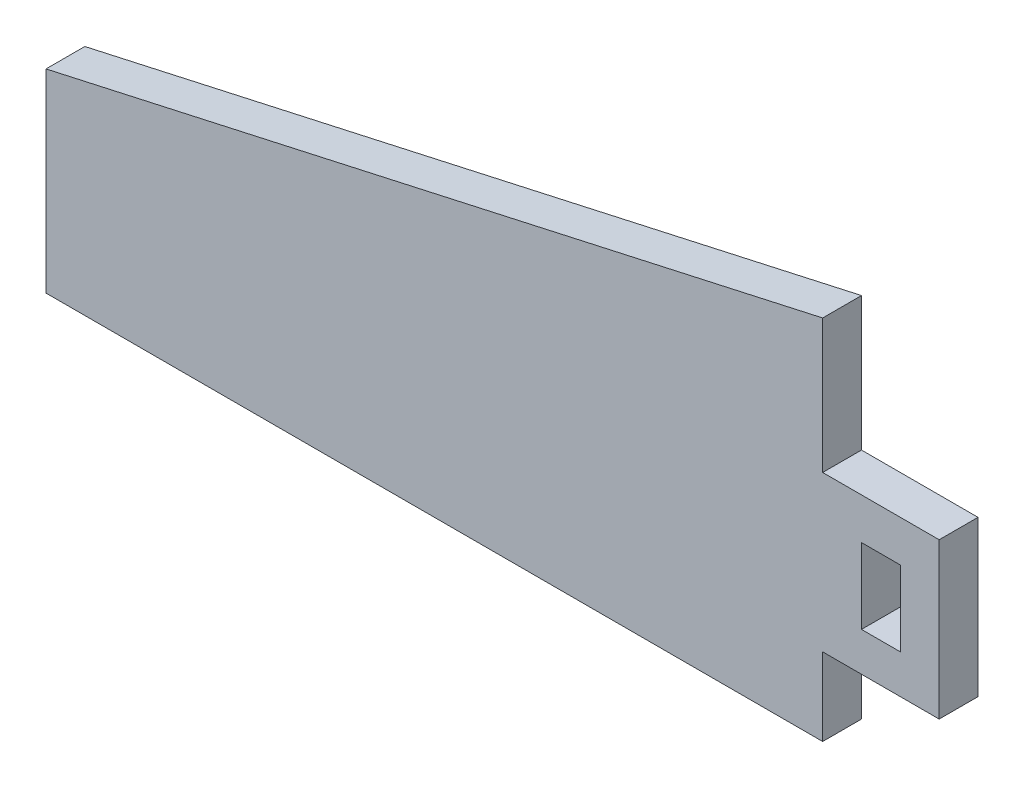
ISO-10303-21;
HEADER;
FILE_DESCRIPTION(('STEP AP214'),'2;1');
FILE_NAME('part.step','',(''),(''),'','','');
FILE_SCHEMA(('AUTOMOTIVE_DESIGN { 1 0 10303 214 1 1 1 1 }'));
ENDSEC;
DATA;
#1=APPLICATION_CONTEXT('core data for automotive mechanical design processes');
#2=APPLICATION_PROTOCOL_DEFINITION('international standard','automotive_design',2000,#1);
#3=PRODUCT_CONTEXT('',#1,'mechanical');
#4=PRODUCT('Part','Part','',(#3));
#5=PRODUCT_RELATED_PRODUCT_CATEGORY('part','',(#4));
#6=PRODUCT_DEFINITION_FORMATION('','',#4);
#7=PRODUCT_DEFINITION_CONTEXT('part definition',#1,'design');
#8=PRODUCT_DEFINITION('design','',#6,#7);
#9=PRODUCT_DEFINITION_SHAPE('','',#8);
#10=(LENGTH_UNIT() NAMED_UNIT(*) SI_UNIT(.MILLI.,.METRE.));
#11=(NAMED_UNIT(*) PLANE_ANGLE_UNIT() SI_UNIT($,.RADIAN.));
#12=(NAMED_UNIT(*) SI_UNIT($,.STERADIAN.) SOLID_ANGLE_UNIT());
#13=UNCERTAINTY_MEASURE_WITH_UNIT(LENGTH_MEASURE(1.E-05),#10,'distance_accuracy_value','');
#14=(GEOMETRIC_REPRESENTATION_CONTEXT(3) GLOBAL_UNCERTAINTY_ASSIGNED_CONTEXT((#13)) GLOBAL_UNIT_ASSIGNED_CONTEXT((#10,
#11,#12)) REPRESENTATION_CONTEXT('',''));
#15=CARTESIAN_POINT('',(0.,0.,0.));
#16=DIRECTION('',(0.,0.,1.));
#17=DIRECTION('',(1.,0.,0.));
#18=AXIS2_PLACEMENT_3D('',#15,#16,#17);
#19=CARTESIAN_POINT('',(0.,0.,5.));
#20=DIRECTION('',(0.,0.,-1.));
#21=DIRECTION('',(-1.,0.,0.));
#22=AXIS2_PLACEMENT_3D('',#19,#20,#21);
#23=PLANE('',#22);
#24=DIRECTION('',(0.,-1.,0.));
#25=VECTOR('',#24,1.);
#26=CARTESIAN_POINT('',(0.,0.,5.));
#27=LINE('',#26,#25);
#28=CARTESIAN_POINT('',(0.,25.,5.));
#29=VERTEX_POINT('',#28);
#30=CARTESIAN_POINT('',(0.,0.,5.));
#31=VERTEX_POINT('',#30);
#32=EDGE_CURVE('E160',#29,#31,#27,.T.);
#33=ORIENTED_EDGE('',*,*,#32,.T.);
#34=DIRECTION('',(1.,0.,0.));
#35=VECTOR('',#34,1.);
#36=CARTESIAN_POINT('',(0.,0.,5.));
#37=LINE('',#36,#35);
#38=CARTESIAN_POINT('',(100.,0.,5.));
#39=VERTEX_POINT('',#38);
#40=EDGE_CURVE('E163',#31,#39,#37,.T.);
#41=ORIENTED_EDGE('',*,*,#40,.T.);
#42=DIRECTION('',(0.,1.,0.));
#43=VECTOR('',#42,1.);
#44=CARTESIAN_POINT('',(100.,0.,5.));
#45=LINE('',#44,#43);
#46=CARTESIAN_POINT('',(100.,10.,5.));
#47=VERTEX_POINT('',#46);
#48=EDGE_CURVE('E166',#39,#47,#45,.T.);
#49=ORIENTED_EDGE('',*,*,#48,.T.);
#50=DIRECTION('',(1.,0.,0.));
#51=VECTOR('',#50,1.);
#52=CARTESIAN_POINT('',(100.,10.,5.));
#53=LINE('',#52,#51);
#54=CARTESIAN_POINT('',(115.,10.,5.));
#55=VERTEX_POINT('',#54);
#56=EDGE_CURVE('E168',#47,#55,#53,.T.);
#57=ORIENTED_EDGE('',*,*,#56,.T.);
#58=DIRECTION('',(0.,1.,0.));
#59=VECTOR('',#58,1.);
#60=CARTESIAN_POINT('',(115.,30.,5.));
#61=LINE('',#60,#59);
#62=CARTESIAN_POINT('',(115.,30.,5.));
#63=VERTEX_POINT('',#62);
#64=EDGE_CURVE('E170',#55,#63,#61,.T.);
#65=ORIENTED_EDGE('',*,*,#64,.T.);
#66=DIRECTION('',(-1.,0.,0.));
#67=VECTOR('',#66,1.);
#68=CARTESIAN_POINT('',(100.,30.,5.));
#69=LINE('',#68,#67);
#70=CARTESIAN_POINT('',(100.,30.,5.));
#71=VERTEX_POINT('',#70);
#72=EDGE_CURVE('E172',#63,#71,#69,.T.);
#73=ORIENTED_EDGE('',*,*,#72,.T.);
#74=DIRECTION('',(0.,1.,0.));
#75=VECTOR('',#74,1.);
#76=CARTESIAN_POINT('',(100.,30.,5.));
#77=LINE('',#76,#75);
#78=CARTESIAN_POINT('',(100.,47.2296627947885,5.));
#79=VERTEX_POINT('',#78);
#80=EDGE_CURVE('E174',#71,#79,#77,.T.);
#81=ORIENTED_EDGE('',*,*,#80,.T.);
#82=DIRECTION('',(-0.976171676674704,-0.216999672023019,0.));
#83=VECTOR('',#82,1.);
#84=CARTESIAN_POINT('',(100.,47.2296627947885,5.));
#85=LINE('',#84,#83);
#86=EDGE_CURVE('E176',#79,#29,#85,.T.);
#87=ORIENTED_EDGE('',*,*,#86,.T.);
#88=EDGE_LOOP('',(#33,#41,#49,#57,#65,#73,#81,#87));
#89=FACE_BOUND('',#88,.T.);
#90=DIRECTION('',(0.,-1.,0.));
#91=VECTOR('',#90,1.);
#92=CARTESIAN_POINT('',(105.,24.6854799336373,5.));
#93=LINE('',#92,#91);
#94=CARTESIAN_POINT('',(105.,24.6854799336373,5.));
#95=VERTEX_POINT('',#94);
#96=CARTESIAN_POINT('',(105.,15.,5.));
#97=VERTEX_POINT('',#96);
#98=EDGE_CURVE('E124',#95,#97,#93,.T.);
#99=ORIENTED_EDGE('',*,*,#98,.F.);
#100=DIRECTION('',(-1.,0.,0.));
#101=VECTOR('',#100,1.);
#102=CARTESIAN_POINT('',(105.,24.6854799336373,5.));
#103=LINE('',#102,#101);
#104=CARTESIAN_POINT('',(110.,24.6854799336373,5.));
#105=VERTEX_POINT('',#104);
#106=EDGE_CURVE('E146',#105,#95,#103,.T.);
#107=ORIENTED_EDGE('',*,*,#106,.F.);
#108=DIRECTION('',(0.,1.,0.));
#109=VECTOR('',#108,1.);
#110=CARTESIAN_POINT('',(110.,24.6854799336373,5.));
#111=LINE('',#110,#109);
#112=CARTESIAN_POINT('',(110.,15.,5.));
#113=VERTEX_POINT('',#112);
#114=EDGE_CURVE('E144',#113,#105,#111,.T.);
#115=ORIENTED_EDGE('',*,*,#114,.F.);
#116=DIRECTION('',(1.,0.,0.));
#117=VECTOR('',#116,1.);
#118=CARTESIAN_POINT('',(105.,15.,5.));
#119=LINE('',#118,#117);
#120=EDGE_CURVE('E132',#97,#113,#119,.T.);
#121=ORIENTED_EDGE('',*,*,#120,.F.);
#122=EDGE_LOOP('',(#99,#107,#115,#121));
#123=FACE_BOUND('',#122,.T.);
#124=ADVANCED_FACE('F35',(#89,#123),#23,.F.);
#125=CARTESIAN_POINT('',(0.,0.,0.));
#126=DIRECTION('',(0.,0.,-1.));
#127=DIRECTION('',(-1.,0.,0.));
#128=AXIS2_PLACEMENT_3D('',#125,#126,#127);
#129=PLANE('',#128);
#130=DIRECTION('',(0.,-1.,0.));
#131=VECTOR('',#130,1.);
#132=CARTESIAN_POINT('',(0.,0.,0.));
#133=LINE('',#132,#131);
#134=CARTESIAN_POINT('',(0.,25.,0.));
#135=VERTEX_POINT('',#134);
#136=CARTESIAN_POINT('',(0.,0.,0.));
#137=VERTEX_POINT('',#136);
#138=EDGE_CURVE('E140',#135,#137,#133,.T.);
#139=ORIENTED_EDGE('',*,*,#138,.F.);
#140=DIRECTION('',(-0.976171676674704,-0.216999672023019,0.));
#141=VECTOR('',#140,1.);
#142=CARTESIAN_POINT('',(100.,47.2296627947885,0.));
#143=LINE('',#142,#141);
#144=CARTESIAN_POINT('',(100.,47.2296627947885,0.));
#145=VERTEX_POINT('',#144);
#146=EDGE_CURVE('E164',#145,#135,#143,.T.);
#147=ORIENTED_EDGE('',*,*,#146,.F.);
#148=DIRECTION('',(0.,1.,0.));
#149=VECTOR('',#148,1.);
#150=CARTESIAN_POINT('',(100.,30.,0.));
#151=LINE('',#150,#149);
#152=CARTESIAN_POINT('',(100.,30.,0.));
#153=VERTEX_POINT('',#152);
#154=EDGE_CURVE('E191',#153,#145,#151,.T.);
#155=ORIENTED_EDGE('',*,*,#154,.F.);
#156=DIRECTION('',(-1.,0.,0.));
#157=VECTOR('',#156,1.);
#158=CARTESIAN_POINT('',(100.,30.,0.));
#159=LINE('',#158,#157);
#160=CARTESIAN_POINT('',(115.,30.,0.));
#161=VERTEX_POINT('',#160);
#162=EDGE_CURVE('E189',#161,#153,#159,.T.);
#163=ORIENTED_EDGE('',*,*,#162,.F.);
#164=DIRECTION('',(0.,1.,0.));
#165=VECTOR('',#164,1.);
#166=CARTESIAN_POINT('',(115.,30.,0.));
#167=LINE('',#166,#165);
#168=CARTESIAN_POINT('',(115.,10.,0.));
#169=VERTEX_POINT('',#168);
#170=EDGE_CURVE('E187',#169,#161,#167,.T.);
#171=ORIENTED_EDGE('',*,*,#170,.F.);
#172=DIRECTION('',(1.,0.,0.));
#173=VECTOR('',#172,1.);
#174=CARTESIAN_POINT('',(100.,10.,0.));
#175=LINE('',#174,#173);
#176=CARTESIAN_POINT('',(100.,10.,0.));
#177=VERTEX_POINT('',#176);
#178=EDGE_CURVE('E185',#177,#169,#175,.T.);
#179=ORIENTED_EDGE('',*,*,#178,.F.);
#180=DIRECTION('',(0.,1.,0.));
#181=VECTOR('',#180,1.);
#182=CARTESIAN_POINT('',(100.,0.,0.));
#183=LINE('',#182,#181);
#184=CARTESIAN_POINT('',(100.,0.,0.));
#185=VERTEX_POINT('',#184);
#186=EDGE_CURVE('E183',#185,#177,#183,.T.);
#187=ORIENTED_EDGE('',*,*,#186,.F.);
#188=DIRECTION('',(1.,0.,0.));
#189=VECTOR('',#188,1.);
#190=CARTESIAN_POINT('',(0.,0.,0.));
#191=LINE('',#190,#189);
#192=EDGE_CURVE('E181',#137,#185,#191,.T.);
#193=ORIENTED_EDGE('',*,*,#192,.F.);
#194=EDGE_LOOP('',(#139,#147,#155,#163,#171,#179,#187,#193));
#195=FACE_BOUND('',#194,.T.);
#196=DIRECTION('',(-1.,0.,0.));
#197=VECTOR('',#196,1.);
#198=CARTESIAN_POINT('',(105.,24.6854799336373,0.));
#199=LINE('',#198,#197);
#200=CARTESIAN_POINT('',(110.,24.6854799336373,0.));
#201=VERTEX_POINT('',#200);
#202=CARTESIAN_POINT('',(105.,24.6854799336373,0.));
#203=VERTEX_POINT('',#202);
#204=EDGE_CURVE('E133',#201,#203,#199,.T.);
#205=ORIENTED_EDGE('',*,*,#204,.T.);
#206=DIRECTION('',(0.,-1.,0.));
#207=VECTOR('',#206,1.);
#208=CARTESIAN_POINT('',(105.,24.6854799336373,0.));
#209=LINE('',#208,#207);
#210=CARTESIAN_POINT('',(105.,15.,0.));
#211=VERTEX_POINT('',#210);
#212=EDGE_CURVE('E58',#203,#211,#209,.T.);
#213=ORIENTED_EDGE('',*,*,#212,.T.);
#214=DIRECTION('',(1.,0.,0.));
#215=VECTOR('',#214,1.);
#216=CARTESIAN_POINT('',(105.,15.,0.));
#217=LINE('',#216,#215);
#218=CARTESIAN_POINT('',(110.,15.,0.));
#219=VERTEX_POINT('',#218);
#220=EDGE_CURVE('E139',#211,#219,#217,.T.);
#221=ORIENTED_EDGE('',*,*,#220,.T.);
#222=DIRECTION('',(0.,1.,0.));
#223=VECTOR('',#222,1.);
#224=CARTESIAN_POINT('',(110.,24.6854799336373,0.));
#225=LINE('',#224,#223);
#226=EDGE_CURVE('E152',#219,#201,#225,.T.);
#227=ORIENTED_EDGE('',*,*,#226,.T.);
#228=EDGE_LOOP('',(#205,#213,#221,#227));
#229=FACE_BOUND('',#228,.T.);
#230=ADVANCED_FACE('F221',(#195,#229),#129,.T.);
#231=CARTESIAN_POINT('',(0.,0.,5.));
#232=DIRECTION('',(1.,0.,0.));
#233=DIRECTION('',(0.,0.,-1.));
#234=AXIS2_PLACEMENT_3D('',#231,#232,#233);
#235=PLANE('',#234);
#236=ORIENTED_EDGE('',*,*,#138,.T.);
#237=DIRECTION('',(0.,0.,-1.));
#238=VECTOR('',#237,1.);
#239=CARTESIAN_POINT('',(0.,0.,5.));
#240=LINE('',#239,#238);
#241=EDGE_CURVE('E11',#31,#137,#240,.T.);
#242=ORIENTED_EDGE('',*,*,#241,.F.);
#243=ORIENTED_EDGE('',*,*,#32,.F.);
#244=DIRECTION('',(0.,0.,-1.));
#245=VECTOR('',#244,1.);
#246=CARTESIAN_POINT('',(0.,25.,5.));
#247=LINE('',#246,#245);
#248=EDGE_CURVE('E178',#29,#135,#247,.T.);
#249=ORIENTED_EDGE('',*,*,#248,.T.);
#250=EDGE_LOOP('',(#236,#242,#243,#249));
#251=FACE_BOUND('',#250,.T.);
#252=ADVANCED_FACE('F37',(#251),#235,.F.);
#253=CARTESIAN_POINT('',(0.,0.,5.));
#254=DIRECTION('',(0.,1.,0.));
#255=DIRECTION('',(0.,0.,1.));
#256=AXIS2_PLACEMENT_3D('',#253,#254,#255);
#257=PLANE('',#256);
#258=ORIENTED_EDGE('',*,*,#192,.T.);
#259=DIRECTION('',(0.,0.,-1.));
#260=VECTOR('',#259,1.);
#261=CARTESIAN_POINT('',(100.,0.,5.));
#262=LINE('',#261,#260);
#263=EDGE_CURVE('E43',#39,#185,#262,.T.);
#264=ORIENTED_EDGE('',*,*,#263,.F.);
#265=ORIENTED_EDGE('',*,*,#40,.F.);
#266=ORIENTED_EDGE('',*,*,#241,.T.);
#267=EDGE_LOOP('',(#258,#264,#265,#266));
#268=FACE_BOUND('',#267,.T.);
#269=ADVANCED_FACE('F238',(#268),#257,.F.);
#270=CARTESIAN_POINT('',(100.,0.,5.));
#271=DIRECTION('',(-1.,0.,0.));
#272=DIRECTION('',(0.,0.,1.));
#273=AXIS2_PLACEMENT_3D('',#270,#271,#272);
#274=PLANE('',#273);
#275=ORIENTED_EDGE('',*,*,#186,.T.);
#276=DIRECTION('',(0.,0.,-1.));
#277=VECTOR('',#276,1.);
#278=CARTESIAN_POINT('',(100.,10.,5.));
#279=LINE('',#278,#277);
#280=EDGE_CURVE('E208',#47,#177,#279,.T.);
#281=ORIENTED_EDGE('',*,*,#280,.F.);
#282=ORIENTED_EDGE('',*,*,#48,.F.);
#283=ORIENTED_EDGE('',*,*,#263,.T.);
#284=EDGE_LOOP('',(#275,#281,#282,#283));
#285=FACE_BOUND('',#284,.T.);
#286=ADVANCED_FACE('F215',(#285),#274,.F.);
#287=CARTESIAN_POINT('',(100.,10.,5.));
#288=DIRECTION('',(0.,1.,0.));
#289=DIRECTION('',(0.,0.,1.));
#290=AXIS2_PLACEMENT_3D('',#287,#288,#289);
#291=PLANE('',#290);
#292=ORIENTED_EDGE('',*,*,#178,.T.);
#293=DIRECTION('',(0.,0.,-1.));
#294=VECTOR('',#293,1.);
#295=CARTESIAN_POINT('',(115.,10.,5.));
#296=LINE('',#295,#294);
#297=EDGE_CURVE('E205',#55,#169,#296,.T.);
#298=ORIENTED_EDGE('',*,*,#297,.F.);
#299=ORIENTED_EDGE('',*,*,#56,.F.);
#300=ORIENTED_EDGE('',*,*,#280,.T.);
#301=EDGE_LOOP('',(#292,#298,#299,#300));
#302=FACE_BOUND('',#301,.T.);
#303=ADVANCED_FACE('F227',(#302),#291,.F.);
#304=CARTESIAN_POINT('',(115.,30.,5.));
#305=DIRECTION('',(-1.,0.,0.));
#306=DIRECTION('',(0.,0.,1.));
#307=AXIS2_PLACEMENT_3D('',#304,#305,#306);
#308=PLANE('',#307);
#309=ORIENTED_EDGE('',*,*,#170,.T.);
#310=DIRECTION('',(0.,0.,-1.));
#311=VECTOR('',#310,1.);
#312=CARTESIAN_POINT('',(115.,30.,5.));
#313=LINE('',#312,#311);
#314=EDGE_CURVE('E202',#63,#161,#313,.T.);
#315=ORIENTED_EDGE('',*,*,#314,.F.);
#316=ORIENTED_EDGE('',*,*,#64,.F.);
#317=ORIENTED_EDGE('',*,*,#297,.T.);
#318=EDGE_LOOP('',(#309,#315,#316,#317));
#319=FACE_BOUND('',#318,.T.);
#320=ADVANCED_FACE('F231',(#319),#308,.F.);
#321=CARTESIAN_POINT('',(100.,30.,5.));
#322=DIRECTION('',(0.,-1.,0.));
#323=DIRECTION('',(0.,0.,-1.));
#324=AXIS2_PLACEMENT_3D('',#321,#322,#323);
#325=PLANE('',#324);
#326=ORIENTED_EDGE('',*,*,#162,.T.);
#327=DIRECTION('',(0.,0.,-1.));
#328=VECTOR('',#327,1.);
#329=CARTESIAN_POINT('',(100.,30.,5.));
#330=LINE('',#329,#328);
#331=EDGE_CURVE('E199',#71,#153,#330,.T.);
#332=ORIENTED_EDGE('',*,*,#331,.F.);
#333=ORIENTED_EDGE('',*,*,#72,.F.);
#334=ORIENTED_EDGE('',*,*,#314,.T.);
#335=EDGE_LOOP('',(#326,#332,#333,#334));
#336=FACE_BOUND('',#335,.T.);
#337=ADVANCED_FACE('F251',(#336),#325,.F.);
#338=CARTESIAN_POINT('',(100.,30.,5.));
#339=DIRECTION('',(-1.,0.,0.));
#340=DIRECTION('',(0.,0.,1.));
#341=AXIS2_PLACEMENT_3D('',#338,#339,#340);
#342=PLANE('',#341);
#343=ORIENTED_EDGE('',*,*,#154,.T.);
#344=DIRECTION('',(0.,0.,-1.));
#345=VECTOR('',#344,1.);
#346=CARTESIAN_POINT('',(100.,47.2296627947885,5.));
#347=LINE('',#346,#345);
#348=EDGE_CURVE('E196',#79,#145,#347,.T.);
#349=ORIENTED_EDGE('',*,*,#348,.F.);
#350=ORIENTED_EDGE('',*,*,#80,.F.);
#351=ORIENTED_EDGE('',*,*,#331,.T.);
#352=EDGE_LOOP('',(#343,#349,#350,#351));
#353=FACE_BOUND('',#352,.T.);
#354=ADVANCED_FACE('F249',(#353),#342,.F.);
#355=CARTESIAN_POINT('',(100.,47.2296627947885,5.));
#356=DIRECTION('',(0.216999672023019,-0.976171676674704,0.));
#357=DIRECTION('',(0.976171676674704,0.216999672023019,0.));
#358=AXIS2_PLACEMENT_3D('',#355,#356,#357);
#359=PLANE('',#358);
#360=ORIENTED_EDGE('',*,*,#146,.T.);
#361=ORIENTED_EDGE('',*,*,#248,.F.);
#362=ORIENTED_EDGE('',*,*,#86,.F.);
#363=ORIENTED_EDGE('',*,*,#348,.T.);
#364=EDGE_LOOP('',(#360,#361,#362,#363));
#365=FACE_BOUND('',#364,.T.);
#366=ADVANCED_FACE('F244',(#365),#359,.F.);
#367=CARTESIAN_POINT('',(105.,24.6854799336373,5.));
#368=DIRECTION('',(1.,0.,0.));
#369=DIRECTION('',(0.,0.,-1.));
#370=AXIS2_PLACEMENT_3D('',#367,#368,#369);
#371=PLANE('',#370);
#372=ORIENTED_EDGE('',*,*,#212,.F.);
#373=DIRECTION('',(0.,0.,-1.));
#374=VECTOR('',#373,1.);
#375=CARTESIAN_POINT('',(105.,24.6854799336373,5.));
#376=LINE('',#375,#374);
#377=EDGE_CURVE('E128',#95,#203,#376,.T.);
#378=ORIENTED_EDGE('',*,*,#377,.F.);
#379=ORIENTED_EDGE('',*,*,#98,.T.);
#380=DIRECTION('',(0.,0.,-1.));
#381=VECTOR('',#380,1.);
#382=CARTESIAN_POINT('',(105.,15.,5.));
#383=LINE('',#382,#381);
#384=EDGE_CURVE('E127',#97,#211,#383,.T.);
#385=ORIENTED_EDGE('',*,*,#384,.T.);
#386=EDGE_LOOP('',(#372,#378,#379,#385));
#387=FACE_BOUND('',#386,.T.);
#388=ADVANCED_FACE('F126',(#387),#371,.T.);
#389=CARTESIAN_POINT('',(105.,15.,5.));
#390=DIRECTION('',(0.,1.,0.));
#391=DIRECTION('',(0.,0.,1.));
#392=AXIS2_PLACEMENT_3D('',#389,#390,#391);
#393=PLANE('',#392);
#394=ORIENTED_EDGE('',*,*,#220,.F.);
#395=ORIENTED_EDGE('',*,*,#384,.F.);
#396=ORIENTED_EDGE('',*,*,#120,.T.);
#397=DIRECTION('',(0.,0.,-1.));
#398=VECTOR('',#397,1.);
#399=CARTESIAN_POINT('',(110.,15.,5.));
#400=LINE('',#399,#398);
#401=EDGE_CURVE('E141',#113,#219,#400,.T.);
#402=ORIENTED_EDGE('',*,*,#401,.T.);
#403=EDGE_LOOP('',(#394,#395,#396,#402));
#404=FACE_BOUND('',#403,.T.);
#405=ADVANCED_FACE('F136',(#404),#393,.T.);
#406=CARTESIAN_POINT('',(110.,24.6854799336373,5.));
#407=DIRECTION('',(-1.,0.,0.));
#408=DIRECTION('',(0.,0.,1.));
#409=AXIS2_PLACEMENT_3D('',#406,#407,#408);
#410=PLANE('',#409);
#411=ORIENTED_EDGE('',*,*,#226,.F.);
#412=ORIENTED_EDGE('',*,*,#401,.F.);
#413=ORIENTED_EDGE('',*,*,#114,.T.);
#414=DIRECTION('',(0.,0.,-1.));
#415=VECTOR('',#414,1.);
#416=CARTESIAN_POINT('',(110.,24.6854799336373,5.));
#417=LINE('',#416,#415);
#418=EDGE_CURVE('E50',#105,#201,#417,.T.);
#419=ORIENTED_EDGE('',*,*,#418,.T.);
#420=EDGE_LOOP('',(#411,#412,#413,#419));
#421=FACE_BOUND('',#420,.T.);
#422=ADVANCED_FACE('F276',(#421),#410,.T.);
#423=CARTESIAN_POINT('',(105.,24.6854799336373,5.));
#424=DIRECTION('',(0.,-1.,0.));
#425=DIRECTION('',(0.,0.,-1.));
#426=AXIS2_PLACEMENT_3D('',#423,#424,#425);
#427=PLANE('',#426);
#428=ORIENTED_EDGE('',*,*,#204,.F.);
#429=ORIENTED_EDGE('',*,*,#418,.F.);
#430=ORIENTED_EDGE('',*,*,#106,.T.);
#431=ORIENTED_EDGE('',*,*,#377,.T.);
#432=EDGE_LOOP('',(#428,#429,#430,#431));
#433=FACE_BOUND('',#432,.T.);
#434=ADVANCED_FACE('F280',(#433),#427,.T.);
#435=CLOSED_SHELL('',(#124,#230,#252,#269,#286,#303,#320,#337,#354,#366,#388,#405,#422,#434));
#436=MANIFOLD_SOLID_BREP('B2',#435);
#437=ADVANCED_BREP_SHAPE_REPRESENTATION('',(#18,#436),#14);
#438=SHAPE_DEFINITION_REPRESENTATION(#9,#437);
ENDSEC;
END-ISO-10303-21;
